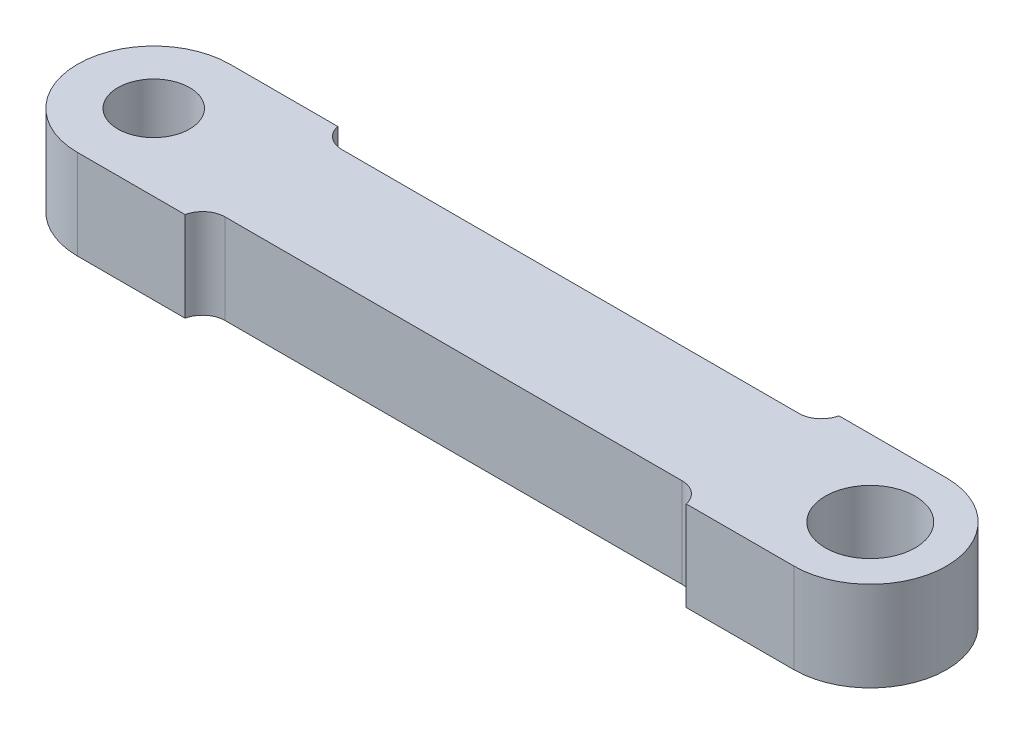
ISO-10303-21;
HEADER;
FILE_DESCRIPTION(('STEP AP214'),'2;1');
FILE_NAME('part.step','',(''),(''),'','','');
FILE_SCHEMA(('AUTOMOTIVE_DESIGN { 1 0 10303 214 1 1 1 1 }'));
ENDSEC;
DATA;
#1=APPLICATION_CONTEXT('core data for automotive mechanical design processes');
#2=APPLICATION_PROTOCOL_DEFINITION('international standard','automotive_design',2000,#1);
#3=PRODUCT_CONTEXT('',#1,'mechanical');
#4=PRODUCT('Part','Part','',(#3));
#5=PRODUCT_RELATED_PRODUCT_CATEGORY('part','',(#4));
#6=PRODUCT_DEFINITION_FORMATION('','',#4);
#7=PRODUCT_DEFINITION_CONTEXT('part definition',#1,'design');
#8=PRODUCT_DEFINITION('design','',#6,#7);
#9=PRODUCT_DEFINITION_SHAPE('','',#8);
#10=(LENGTH_UNIT() NAMED_UNIT(*) SI_UNIT(.MILLI.,.METRE.));
#11=(NAMED_UNIT(*) PLANE_ANGLE_UNIT() SI_UNIT($,.RADIAN.));
#12=(NAMED_UNIT(*) SI_UNIT($,.STERADIAN.) SOLID_ANGLE_UNIT());
#13=UNCERTAINTY_MEASURE_WITH_UNIT(LENGTH_MEASURE(1.E-05),#10,'distance_accuracy_value','');
#14=(GEOMETRIC_REPRESENTATION_CONTEXT(3) GLOBAL_UNCERTAINTY_ASSIGNED_CONTEXT((#13)) GLOBAL_UNIT_ASSIGNED_CONTEXT((#10,
#11,#12)) REPRESENTATION_CONTEXT('',''));
#15=CARTESIAN_POINT('',(0.,0.,0.));
#16=DIRECTION('',(0.,0.,1.));
#17=DIRECTION('',(1.,0.,0.));
#18=AXIS2_PLACEMENT_3D('',#15,#16,#17);
#19=CARTESIAN_POINT('',(798.,100.,0.));
#20=DIRECTION('',(0.,1.,0.));
#21=DIRECTION('',(0.,0.,1.));
#22=AXIS2_PLACEMENT_3D('',#19,#20,#21);
#23=PLANE('',#22);
#24=CARTESIAN_POINT('',(798.,100.,0.));
#25=DIRECTION('',(0.,1.,0.));
#26=DIRECTION('',(0.,0.,1.));
#27=AXIS2_PLACEMENT_3D('',#24,#25,#26);
#28=CIRCLE('',#27,50.);
#29=CARTESIAN_POINT('',(798.,100.,50.));
#30=VERTEX_POINT('',#29);
#31=EDGE_CURVE('E200',#30,#30,#28,.T.);
#32=ORIENTED_EDGE('',*,*,#31,.F.);
#33=EDGE_LOOP('',(#32));
#34=FACE_BOUND('',#33,.T.);
#35=DIRECTION('',(-1.,0.,0.));
#36=VECTOR('',#35,1.);
#37=CARTESIAN_POINT('',(678.,100.,-85.));
#38=LINE('',#37,#36);
#39=CARTESIAN_POINT('',(798.,100.,-85.));
#40=VERTEX_POINT('',#39);
#41=CARTESIAN_POINT('',(678.,100.,-85.));
#42=VERTEX_POINT('',#41);
#43=EDGE_CURVE('E122',#40,#42,#38,.T.);
#44=ORIENTED_EDGE('',*,*,#43,.T.);
#45=CARTESIAN_POINT('',(653.505102572168,100.,-90.));
#46=DIRECTION('',(0.,1.,0.));
#47=DIRECTION('',(0.,0.,1.));
#48=AXIS2_PLACEMENT_3D('',#45,#46,#47);
#49=CIRCLE('',#48,25.);
#50=CARTESIAN_POINT('',(653.505102572168,100.,-65.));
#51=VERTEX_POINT('',#50);
#52=EDGE_CURVE('E57',#42,#51,#49,.F.);
#53=ORIENTED_EDGE('',*,*,#52,.T.);
#54=DIRECTION('',(-1.,0.,0.));
#55=VECTOR('',#54,1.);
#56=CARTESIAN_POINT('',(120.,100.,-65.));
#57=LINE('',#56,#55);
#58=CARTESIAN_POINT('',(144.494897427832,100.,-65.));
#59=VERTEX_POINT('',#58);
#60=EDGE_CURVE('E130',#51,#59,#57,.T.);
#61=ORIENTED_EDGE('',*,*,#60,.T.);
#62=CARTESIAN_POINT('',(144.494897427832,100.,-90.));
#63=DIRECTION('',(0.,1.,0.));
#64=DIRECTION('',(0.,0.,1.));
#65=AXIS2_PLACEMENT_3D('',#62,#63,#64);
#66=CIRCLE('',#65,25.);
#67=CARTESIAN_POINT('',(120.,100.,-85.));
#68=VERTEX_POINT('',#67);
#69=EDGE_CURVE('E11',#59,#68,#66,.F.);
#70=ORIENTED_EDGE('',*,*,#69,.T.);
#71=DIRECTION('',(-1.,0.,0.));
#72=VECTOR('',#71,1.);
#73=CARTESIAN_POINT('',(0.,100.,-85.));
#74=LINE('',#73,#72);
#75=CARTESIAN_POINT('',(0.,100.,-85.));
#76=VERTEX_POINT('',#75);
#77=EDGE_CURVE('E211',#68,#76,#74,.T.);
#78=ORIENTED_EDGE('',*,*,#77,.T.);
#79=CARTESIAN_POINT('',(0.,100.,0.));
#80=DIRECTION('',(0.,1.,0.));
#81=DIRECTION('',(0.,0.,1.));
#82=AXIS2_PLACEMENT_3D('',#79,#80,#81);
#83=CIRCLE('',#82,85.);
#84=CARTESIAN_POINT('',(0.,100.,85.));
#85=VERTEX_POINT('',#84);
#86=EDGE_CURVE('E209',#76,#85,#83,.T.);
#87=ORIENTED_EDGE('',*,*,#86,.T.);
#88=DIRECTION('',(1.,0.,0.));
#89=VECTOR('',#88,1.);
#90=CARTESIAN_POINT('',(0.,100.,85.));
#91=LINE('',#90,#89);
#92=CARTESIAN_POINT('',(120.,100.,85.));
#93=VERTEX_POINT('',#92);
#94=EDGE_CURVE('E207',#85,#93,#91,.T.);
#95=ORIENTED_EDGE('',*,*,#94,.T.);
#96=CARTESIAN_POINT('',(144.494897427832,100.,90.));
#97=DIRECTION('',(0.,1.,0.));
#98=DIRECTION('',(0.,0.,1.));
#99=AXIS2_PLACEMENT_3D('',#96,#97,#98);
#100=CIRCLE('',#99,25.);
#101=CARTESIAN_POINT('',(144.494897427832,100.,65.));
#102=VERTEX_POINT('',#101);
#103=EDGE_CURVE('E155',#93,#102,#100,.F.);
#104=ORIENTED_EDGE('',*,*,#103,.T.);
#105=DIRECTION('',(1.,0.,0.));
#106=VECTOR('',#105,1.);
#107=CARTESIAN_POINT('',(120.,100.,65.));
#108=LINE('',#107,#106);
#109=CARTESIAN_POINT('',(653.505102572168,100.,65.));
#110=VERTEX_POINT('',#109);
#111=EDGE_CURVE('E204',#102,#110,#108,.T.);
#112=ORIENTED_EDGE('',*,*,#111,.T.);
#113=CARTESIAN_POINT('',(653.505102572168,100.,90.));
#114=DIRECTION('',(0.,1.,0.));
#115=DIRECTION('',(0.,0.,1.));
#116=AXIS2_PLACEMENT_3D('',#113,#114,#115);
#117=CIRCLE('',#116,25.);
#118=CARTESIAN_POINT('',(678.,100.,85.));
#119=VERTEX_POINT('',#118);
#120=EDGE_CURVE('E149',#110,#119,#117,.F.);
#121=ORIENTED_EDGE('',*,*,#120,.T.);
#122=DIRECTION('',(1.,0.,0.));
#123=VECTOR('',#122,1.);
#124=CARTESIAN_POINT('',(678.,100.,85.));
#125=LINE('',#124,#123);
#126=CARTESIAN_POINT('',(798.,100.,85.));
#127=VERTEX_POINT('',#126);
#128=EDGE_CURVE('E202',#119,#127,#125,.T.);
#129=ORIENTED_EDGE('',*,*,#128,.T.);
#130=CARTESIAN_POINT('',(798.,100.,0.));
#131=DIRECTION('',(0.,1.,0.));
#132=DIRECTION('',(0.,0.,1.));
#133=AXIS2_PLACEMENT_3D('',#130,#131,#132);
#134=CIRCLE('',#133,85.);
#135=EDGE_CURVE('E126',#127,#40,#134,.T.);
#136=ORIENTED_EDGE('',*,*,#135,.T.);
#137=EDGE_LOOP('',(#44,#53,#61,#70,#78,#87,#95,#104,#112,#121,#129,#136));
#138=FACE_BOUND('',#137,.T.);
#139=CARTESIAN_POINT('',(0.,100.,0.));
#140=DIRECTION('',(0.,1.,0.));
#141=DIRECTION('',(0.,0.,1.));
#142=AXIS2_PLACEMENT_3D('',#139,#140,#141);
#143=CIRCLE('',#142,40.);
#144=CARTESIAN_POINT('',(0.,100.,40.));
#145=VERTEX_POINT('',#144);
#146=EDGE_CURVE('E217',#145,#145,#143,.T.);
#147=ORIENTED_EDGE('',*,*,#146,.F.);
#148=EDGE_LOOP('',(#147));
#149=FACE_BOUND('',#148,.T.);
#150=ADVANCED_FACE('F35',(#34,#138,#149),#23,.T.);
#151=CARTESIAN_POINT('',(798.,0.,0.));
#152=DIRECTION('',(0.,1.,0.));
#153=DIRECTION('',(0.,0.,1.));
#154=AXIS2_PLACEMENT_3D('',#151,#152,#153);
#155=PLANE('',#154);
#156=DIRECTION('',(-1.,0.,0.));
#157=VECTOR('',#156,1.);
#158=CARTESIAN_POINT('',(678.,0.,-85.));
#159=LINE('',#158,#157);
#160=CARTESIAN_POINT('',(798.,0.,-85.));
#161=VERTEX_POINT('',#160);
#162=CARTESIAN_POINT('',(678.,0.,-85.));
#163=VERTEX_POINT('',#162);
#164=EDGE_CURVE('E138',#161,#163,#159,.T.);
#165=ORIENTED_EDGE('',*,*,#164,.F.);
#166=CARTESIAN_POINT('',(798.,0.,0.));
#167=DIRECTION('',(0.,1.,0.));
#168=DIRECTION('',(0.,0.,1.));
#169=AXIS2_PLACEMENT_3D('',#166,#167,#168);
#170=CIRCLE('',#169,85.);
#171=CARTESIAN_POINT('',(798.,0.,85.));
#172=VERTEX_POINT('',#171);
#173=EDGE_CURVE('E131',#172,#161,#170,.T.);
#174=ORIENTED_EDGE('',*,*,#173,.F.);
#175=DIRECTION('',(1.,0.,0.));
#176=VECTOR('',#175,1.);
#177=CARTESIAN_POINT('',(678.,0.,85.));
#178=LINE('',#177,#176);
#179=CARTESIAN_POINT('',(678.,0.,85.));
#180=VERTEX_POINT('',#179);
#181=EDGE_CURVE('E185',#180,#172,#178,.T.);
#182=ORIENTED_EDGE('',*,*,#181,.F.);
#183=CARTESIAN_POINT('',(653.505102572168,0.,90.));
#184=DIRECTION('',(0.,1.,0.));
#185=DIRECTION('',(0.,0.,1.));
#186=AXIS2_PLACEMENT_3D('',#183,#184,#185);
#187=CIRCLE('',#186,25.);
#188=CARTESIAN_POINT('',(653.505102572168,0.,65.));
#189=VERTEX_POINT('',#188);
#190=EDGE_CURVE('E153',#180,#189,#187,.T.);
#191=ORIENTED_EDGE('',*,*,#190,.T.);
#192=DIRECTION('',(1.,0.,0.));
#193=VECTOR('',#192,1.);
#194=CARTESIAN_POINT('',(120.,0.,65.));
#195=LINE('',#194,#193);
#196=CARTESIAN_POINT('',(144.494897427832,0.,65.));
#197=VERTEX_POINT('',#196);
#198=EDGE_CURVE('E187',#197,#189,#195,.T.);
#199=ORIENTED_EDGE('',*,*,#198,.F.);
#200=CARTESIAN_POINT('',(144.494897427832,0.,90.));
#201=DIRECTION('',(0.,1.,0.));
#202=DIRECTION('',(0.,0.,1.));
#203=AXIS2_PLACEMENT_3D('',#200,#201,#202);
#204=CIRCLE('',#203,25.);
#205=CARTESIAN_POINT('',(120.,0.,85.));
#206=VERTEX_POINT('',#205);
#207=EDGE_CURVE('E157',#197,#206,#204,.T.);
#208=ORIENTED_EDGE('',*,*,#207,.T.);
#209=DIRECTION('',(1.,0.,0.));
#210=VECTOR('',#209,1.);
#211=CARTESIAN_POINT('',(0.,0.,85.));
#212=LINE('',#211,#210);
#213=CARTESIAN_POINT('',(0.,0.,85.));
#214=VERTEX_POINT('',#213);
#215=EDGE_CURVE('E190',#214,#206,#212,.T.);
#216=ORIENTED_EDGE('',*,*,#215,.F.);
#217=CARTESIAN_POINT('',(0.,0.,0.));
#218=DIRECTION('',(0.,1.,0.));
#219=DIRECTION('',(0.,0.,1.));
#220=AXIS2_PLACEMENT_3D('',#217,#218,#219);
#221=CIRCLE('',#220,85.);
#222=CARTESIAN_POINT('',(0.,0.,-85.));
#223=VERTEX_POINT('',#222);
#224=EDGE_CURVE('E193',#223,#214,#221,.T.);
#225=ORIENTED_EDGE('',*,*,#224,.F.);
#226=DIRECTION('',(-1.,0.,0.));
#227=VECTOR('',#226,1.);
#228=CARTESIAN_POINT('',(0.,0.,-85.));
#229=LINE('',#228,#227);
#230=CARTESIAN_POINT('',(120.,0.,-85.));
#231=VERTEX_POINT('',#230);
#232=EDGE_CURVE('E195',#231,#223,#229,.T.);
#233=ORIENTED_EDGE('',*,*,#232,.F.);
#234=CARTESIAN_POINT('',(144.494897427832,0.,-90.));
#235=DIRECTION('',(0.,1.,0.));
#236=DIRECTION('',(0.,0.,1.));
#237=AXIS2_PLACEMENT_3D('',#234,#235,#236);
#238=CIRCLE('',#237,25.);
#239=CARTESIAN_POINT('',(144.494897427832,0.,-65.));
#240=VERTEX_POINT('',#239);
#241=EDGE_CURVE('E43',#231,#240,#238,.T.);
#242=ORIENTED_EDGE('',*,*,#241,.T.);
#243=DIRECTION('',(-1.,0.,0.));
#244=VECTOR('',#243,1.);
#245=CARTESIAN_POINT('',(120.,0.,-65.));
#246=LINE('',#245,#244);
#247=CARTESIAN_POINT('',(653.505102572168,0.,-65.));
#248=VERTEX_POINT('',#247);
#249=EDGE_CURVE('E197',#248,#240,#246,.T.);
#250=ORIENTED_EDGE('',*,*,#249,.F.);
#251=CARTESIAN_POINT('',(653.505102572168,0.,-90.));
#252=DIRECTION('',(0.,1.,0.));
#253=DIRECTION('',(0.,0.,1.));
#254=AXIS2_PLACEMENT_3D('',#251,#252,#253);
#255=CIRCLE('',#254,25.);
#256=EDGE_CURVE('E147',#248,#163,#255,.T.);
#257=ORIENTED_EDGE('',*,*,#256,.T.);
#258=EDGE_LOOP('',(#165,#174,#182,#191,#199,#208,#216,#225,#233,#242,#250,#257));
#259=FACE_BOUND('',#258,.T.);
#260=CARTESIAN_POINT('',(798.,0.,0.));
#261=DIRECTION('',(0.,1.,0.));
#262=DIRECTION('',(0.,0.,1.));
#263=AXIS2_PLACEMENT_3D('',#260,#261,#262);
#264=CIRCLE('',#263,50.);
#265=CARTESIAN_POINT('',(798.,0.,50.));
#266=VERTEX_POINT('',#265);
#267=EDGE_CURVE('E214',#266,#266,#264,.T.);
#268=ORIENTED_EDGE('',*,*,#267,.T.);
#269=EDGE_LOOP('',(#268));
#270=FACE_BOUND('',#269,.T.);
#271=CARTESIAN_POINT('',(0.,0.,0.));
#272=DIRECTION('',(0.,1.,0.));
#273=DIRECTION('',(0.,0.,1.));
#274=AXIS2_PLACEMENT_3D('',#271,#272,#273);
#275=CIRCLE('',#274,40.);
#276=CARTESIAN_POINT('',(0.,0.,40.));
#277=VERTEX_POINT('',#276);
#278=EDGE_CURVE('E220',#277,#277,#275,.T.);
#279=ORIENTED_EDGE('',*,*,#278,.T.);
#280=EDGE_LOOP('',(#279));
#281=FACE_BOUND('',#280,.T.);
#282=ADVANCED_FACE('F229',(#259,#270,#281),#155,.F.);
#283=CARTESIAN_POINT('',(678.,100.,-85.));
#284=DIRECTION('',(0.,0.,1.));
#285=DIRECTION('',(1.,0.,0.));
#286=AXIS2_PLACEMENT_3D('',#283,#284,#285);
#287=PLANE('',#286);
#288=ORIENTED_EDGE('',*,*,#164,.T.);
#289=DIRECTION('',(0.,-1.,0.));
#290=VECTOR('',#289,1.);
#291=CARTESIAN_POINT('',(678.,100.,-85.));
#292=LINE('',#291,#290);
#293=EDGE_CURVE('E135',#42,#163,#292,.T.);
#294=ORIENTED_EDGE('',*,*,#293,.F.);
#295=ORIENTED_EDGE('',*,*,#43,.F.);
#296=DIRECTION('',(0.,-1.,0.));
#297=VECTOR('',#296,1.);
#298=CARTESIAN_POINT('',(798.,100.,-85.));
#299=LINE('',#298,#297);
#300=EDGE_CURVE('E182',#40,#161,#299,.T.);
#301=ORIENTED_EDGE('',*,*,#300,.T.);
#302=EDGE_LOOP('',(#288,#294,#295,#301));
#303=FACE_BOUND('',#302,.T.);
#304=ADVANCED_FACE('F136',(#303),#287,.F.);
#305=CARTESIAN_POINT('',(120.,100.,-65.));
#306=DIRECTION('',(0.,0.,1.));
#307=DIRECTION('',(1.,0.,0.));
#308=AXIS2_PLACEMENT_3D('',#305,#306,#307);
#309=PLANE('',#308);
#310=ORIENTED_EDGE('',*,*,#60,.F.);
#311=DIRECTION('',(0.,-1.,0.));
#312=VECTOR('',#311,1.);
#313=CARTESIAN_POINT('',(653.505102572168,100.,-65.));
#314=LINE('',#313,#312);
#315=EDGE_CURVE('E146',#51,#248,#314,.T.);
#316=ORIENTED_EDGE('',*,*,#315,.T.);
#317=ORIENTED_EDGE('',*,*,#249,.T.);
#318=DIRECTION('',(0.,1.,0.));
#319=VECTOR('',#318,1.);
#320=CARTESIAN_POINT('',(144.494897427832,100.,-65.));
#321=LINE('',#320,#319);
#322=EDGE_CURVE('E50',#240,#59,#321,.T.);
#323=ORIENTED_EDGE('',*,*,#322,.T.);
#324=EDGE_LOOP('',(#310,#316,#317,#323));
#325=FACE_BOUND('',#324,.T.);
#326=ADVANCED_FACE('F265',(#325),#309,.F.);
#327=CARTESIAN_POINT('',(0.,100.,-85.));
#328=DIRECTION('',(0.,0.,1.));
#329=DIRECTION('',(1.,0.,0.));
#330=AXIS2_PLACEMENT_3D('',#327,#328,#329);
#331=PLANE('',#330);
#332=ORIENTED_EDGE('',*,*,#232,.T.);
#333=DIRECTION('',(0.,-1.,0.));
#334=VECTOR('',#333,1.);
#335=CARTESIAN_POINT('',(0.,100.,-85.));
#336=LINE('',#335,#334);
#337=EDGE_CURVE('E167',#76,#223,#336,.T.);
#338=ORIENTED_EDGE('',*,*,#337,.F.);
#339=ORIENTED_EDGE('',*,*,#77,.F.);
#340=DIRECTION('',(0.,-1.,0.));
#341=VECTOR('',#340,1.);
#342=CARTESIAN_POINT('',(120.,100.,-85.));
#343=LINE('',#342,#341);
#344=EDGE_CURVE('E141',#68,#231,#343,.T.);
#345=ORIENTED_EDGE('',*,*,#344,.T.);
#346=EDGE_LOOP('',(#332,#338,#339,#345));
#347=FACE_BOUND('',#346,.T.);
#348=ADVANCED_FACE('F261',(#347),#331,.F.);
#349=CARTESIAN_POINT('',(0.,100.,0.));
#350=DIRECTION('',(0.,-1.,0.));
#351=DIRECTION('',(0.,0.,-1.));
#352=AXIS2_PLACEMENT_3D('',#349,#350,#351);
#353=CYLINDRICAL_SURFACE('',#352,85.);
#354=ORIENTED_EDGE('',*,*,#224,.T.);
#355=DIRECTION('',(0.,-1.,0.));
#356=VECTOR('',#355,1.);
#357=CARTESIAN_POINT('',(0.,100.,85.));
#358=LINE('',#357,#356);
#359=EDGE_CURVE('E170',#85,#214,#358,.T.);
#360=ORIENTED_EDGE('',*,*,#359,.F.);
#361=ORIENTED_EDGE('',*,*,#86,.F.);
#362=ORIENTED_EDGE('',*,*,#337,.T.);
#363=EDGE_LOOP('',(#354,#360,#361,#362));
#364=FACE_BOUND('',#363,.T.);
#365=ADVANCED_FACE('F257',(#364),#353,.T.);
#366=CARTESIAN_POINT('',(0.,100.,85.));
#367=DIRECTION('',(0.,0.,-1.));
#368=DIRECTION('',(-1.,0.,0.));
#369=AXIS2_PLACEMENT_3D('',#366,#367,#368);
#370=PLANE('',#369);
#371=ORIENTED_EDGE('',*,*,#215,.T.);
#372=DIRECTION('',(0.,-1.,0.));
#373=VECTOR('',#372,1.);
#374=CARTESIAN_POINT('',(120.,100.,85.));
#375=LINE('',#374,#373);
#376=EDGE_CURVE('E173',#93,#206,#375,.T.);
#377=ORIENTED_EDGE('',*,*,#376,.F.);
#378=ORIENTED_EDGE('',*,*,#94,.F.);
#379=ORIENTED_EDGE('',*,*,#359,.T.);
#380=EDGE_LOOP('',(#371,#377,#378,#379));
#381=FACE_BOUND('',#380,.T.);
#382=ADVANCED_FACE('F253',(#381),#370,.F.);
#383=CARTESIAN_POINT('',(120.,100.,65.));
#384=DIRECTION('',(0.,0.,-1.));
#385=DIRECTION('',(-1.,0.,0.));
#386=AXIS2_PLACEMENT_3D('',#383,#384,#385);
#387=PLANE('',#386);
#388=ORIENTED_EDGE('',*,*,#111,.F.);
#389=DIRECTION('',(0.,-1.,0.));
#390=VECTOR('',#389,1.);
#391=CARTESIAN_POINT('',(144.494897427832,100.,65.));
#392=LINE('',#391,#390);
#393=EDGE_CURVE('E161',#102,#197,#392,.T.);
#394=ORIENTED_EDGE('',*,*,#393,.T.);
#395=ORIENTED_EDGE('',*,*,#198,.T.);
#396=DIRECTION('',(0.,1.,0.));
#397=VECTOR('',#396,1.);
#398=CARTESIAN_POINT('',(653.505102572168,100.,65.));
#399=LINE('',#398,#397);
#400=EDGE_CURVE('E140',#189,#110,#399,.T.);
#401=ORIENTED_EDGE('',*,*,#400,.T.);
#402=EDGE_LOOP('',(#388,#394,#395,#401));
#403=FACE_BOUND('',#402,.T.);
#404=ADVANCED_FACE('F249',(#403),#387,.F.);
#405=CARTESIAN_POINT('',(678.,100.,85.));
#406=DIRECTION('',(0.,0.,-1.));
#407=DIRECTION('',(-1.,0.,0.));
#408=AXIS2_PLACEMENT_3D('',#405,#406,#407);
#409=PLANE('',#408);
#410=ORIENTED_EDGE('',*,*,#181,.T.);
#411=DIRECTION('',(0.,-1.,0.));
#412=VECTOR('',#411,1.);
#413=CARTESIAN_POINT('',(798.,100.,85.));
#414=LINE('',#413,#412);
#415=EDGE_CURVE('E179',#127,#172,#414,.T.);
#416=ORIENTED_EDGE('',*,*,#415,.F.);
#417=ORIENTED_EDGE('',*,*,#128,.F.);
#418=DIRECTION('',(0.,-1.,0.));
#419=VECTOR('',#418,1.);
#420=CARTESIAN_POINT('',(678.,100.,85.));
#421=LINE('',#420,#419);
#422=EDGE_CURVE('E176',#119,#180,#421,.T.);
#423=ORIENTED_EDGE('',*,*,#422,.T.);
#424=EDGE_LOOP('',(#410,#416,#417,#423));
#425=FACE_BOUND('',#424,.T.);
#426=ADVANCED_FACE('F245',(#425),#409,.F.);
#427=CARTESIAN_POINT('',(798.,100.,0.));
#428=DIRECTION('',(0.,-1.,0.));
#429=DIRECTION('',(0.,0.,-1.));
#430=AXIS2_PLACEMENT_3D('',#427,#428,#429);
#431=CYLINDRICAL_SURFACE('',#430,85.);
#432=ORIENTED_EDGE('',*,*,#173,.T.);
#433=ORIENTED_EDGE('',*,*,#300,.F.);
#434=ORIENTED_EDGE('',*,*,#135,.F.);
#435=ORIENTED_EDGE('',*,*,#415,.T.);
#436=EDGE_LOOP('',(#432,#433,#434,#435));
#437=FACE_BOUND('',#436,.T.);
#438=ADVANCED_FACE('F242',(#437),#431,.T.);
#439=CARTESIAN_POINT('',(798.,100.,0.));
#440=DIRECTION('',(0.,-1.,0.));
#441=DIRECTION('',(0.,0.,-1.));
#442=AXIS2_PLACEMENT_3D('',#439,#440,#441);
#443=CYLINDRICAL_SURFACE('',#442,50.);
#444=ORIENTED_EDGE('',*,*,#31,.T.);
#445=EDGE_LOOP('',(#444));
#446=FACE_BOUND('',#445,.T.);
#447=ORIENTED_EDGE('',*,*,#267,.F.);
#448=EDGE_LOOP('',(#447));
#449=FACE_BOUND('',#448,.T.);
#450=ADVANCED_FACE('F239',(#446,#449),#443,.F.);
#451=CARTESIAN_POINT('',(0.,100.,0.));
#452=DIRECTION('',(0.,-1.,0.));
#453=DIRECTION('',(0.,0.,-1.));
#454=AXIS2_PLACEMENT_3D('',#451,#452,#453);
#455=CYLINDRICAL_SURFACE('',#454,40.);
#456=ORIENTED_EDGE('',*,*,#146,.T.);
#457=EDGE_LOOP('',(#456));
#458=FACE_BOUND('',#457,.T.);
#459=ORIENTED_EDGE('',*,*,#278,.F.);
#460=EDGE_LOOP('',(#459));
#461=FACE_BOUND('',#460,.T.);
#462=ADVANCED_FACE('F226',(#458,#461),#455,.F.);
#463=CARTESIAN_POINT('',(144.494897427832,100.,90.));
#464=DIRECTION('',(0.,-1.,0.));
#465=DIRECTION('',(0.,0.,-1.));
#466=AXIS2_PLACEMENT_3D('',#463,#464,#465);
#467=CYLINDRICAL_SURFACE('',#466,25.);
#468=ORIENTED_EDGE('',*,*,#103,.F.);
#469=ORIENTED_EDGE('',*,*,#376,.T.);
#470=ORIENTED_EDGE('',*,*,#207,.F.);
#471=ORIENTED_EDGE('',*,*,#393,.F.);
#472=EDGE_LOOP('',(#468,#469,#470,#471));
#473=FACE_BOUND('',#472,.T.);
#474=ADVANCED_FACE('F271',(#473),#467,.F.);
#475=CARTESIAN_POINT('',(653.505102572168,100.,90.));
#476=DIRECTION('',(0.,1.,0.));
#477=DIRECTION('',(0.,0.,1.));
#478=AXIS2_PLACEMENT_3D('',#475,#476,#477);
#479=CYLINDRICAL_SURFACE('',#478,25.);
#480=ORIENTED_EDGE('',*,*,#120,.F.);
#481=ORIENTED_EDGE('',*,*,#400,.F.);
#482=ORIENTED_EDGE('',*,*,#190,.F.);
#483=ORIENTED_EDGE('',*,*,#422,.F.);
#484=EDGE_LOOP('',(#480,#481,#482,#483));
#485=FACE_BOUND('',#484,.T.);
#486=ADVANCED_FACE('F274',(#485),#479,.F.);
#487=CARTESIAN_POINT('',(653.505102572168,100.,-90.));
#488=DIRECTION('',(0.,-1.,0.));
#489=DIRECTION('',(0.,0.,-1.));
#490=AXIS2_PLACEMENT_3D('',#487,#488,#489);
#491=CYLINDRICAL_SURFACE('',#490,25.);
#492=ORIENTED_EDGE('',*,*,#52,.F.);
#493=ORIENTED_EDGE('',*,*,#293,.T.);
#494=ORIENTED_EDGE('',*,*,#256,.F.);
#495=ORIENTED_EDGE('',*,*,#315,.F.);
#496=EDGE_LOOP('',(#492,#493,#494,#495));
#497=FACE_BOUND('',#496,.T.);
#498=ADVANCED_FACE('F144',(#497),#491,.F.);
#499=CARTESIAN_POINT('',(144.494897427832,100.,-90.));
#500=DIRECTION('',(0.,1.,0.));
#501=DIRECTION('',(0.,0.,1.));
#502=AXIS2_PLACEMENT_3D('',#499,#500,#501);
#503=CYLINDRICAL_SURFACE('',#502,25.);
#504=ORIENTED_EDGE('',*,*,#69,.F.);
#505=ORIENTED_EDGE('',*,*,#322,.F.);
#506=ORIENTED_EDGE('',*,*,#241,.F.);
#507=ORIENTED_EDGE('',*,*,#344,.F.);
#508=EDGE_LOOP('',(#504,#505,#506,#507));
#509=FACE_BOUND('',#508,.T.);
#510=ADVANCED_FACE('F37',(#509),#503,.F.);
#511=CLOSED_SHELL('',(#150,#282,#304,#326,#348,#365,#382,#404,#426,#438,#450,#462,#474,#486,
#498,#510));
#512=MANIFOLD_SOLID_BREP('B2',#511);
#513=ADVANCED_BREP_SHAPE_REPRESENTATION('',(#18,#512),#14);
#514=SHAPE_DEFINITION_REPRESENTATION(#9,#513);
ENDSEC;
END-ISO-10303-21;
